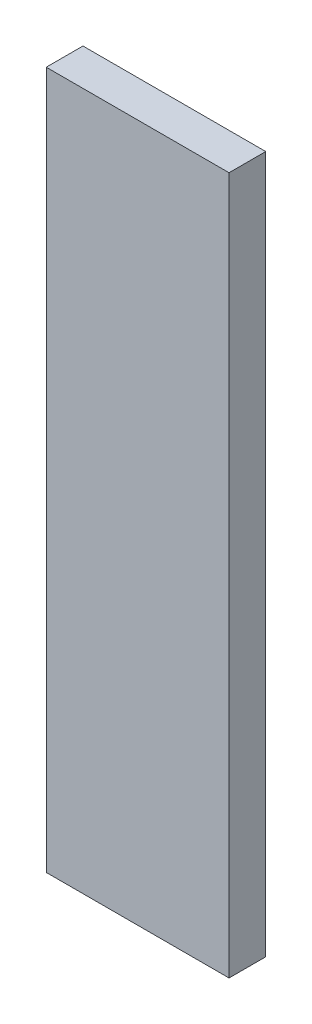
ISO-10303-21;
HEADER;
FILE_DESCRIPTION(('STEP AP214'),'2;1');
FILE_NAME('part.step','',(''),(''),'','','');
FILE_SCHEMA(('AUTOMOTIVE_DESIGN { 1 0 10303 214 1 1 1 1 }'));
ENDSEC;
DATA;
#1=APPLICATION_CONTEXT('core data for automotive mechanical design processes');
#2=APPLICATION_PROTOCOL_DEFINITION('international standard','automotive_design',2000,#1);
#3=PRODUCT_CONTEXT('',#1,'mechanical');
#4=PRODUCT('Part','Part','',(#3));
#5=PRODUCT_RELATED_PRODUCT_CATEGORY('part','',(#4));
#6=PRODUCT_DEFINITION_FORMATION('','',#4);
#7=PRODUCT_DEFINITION_CONTEXT('part definition',#1,'design');
#8=PRODUCT_DEFINITION('design','',#6,#7);
#9=PRODUCT_DEFINITION_SHAPE('','',#8);
#10=(LENGTH_UNIT() NAMED_UNIT(*) SI_UNIT(.MILLI.,.METRE.));
#11=(NAMED_UNIT(*) PLANE_ANGLE_UNIT() SI_UNIT($,.RADIAN.));
#12=(NAMED_UNIT(*) SI_UNIT($,.STERADIAN.) SOLID_ANGLE_UNIT());
#13=UNCERTAINTY_MEASURE_WITH_UNIT(LENGTH_MEASURE(1.E-05),#10,'distance_accuracy_value','');
#14=(GEOMETRIC_REPRESENTATION_CONTEXT(3) GLOBAL_UNCERTAINTY_ASSIGNED_CONTEXT((#13)) GLOBAL_UNIT_ASSIGNED_CONTEXT((#10,
#11,#12)) REPRESENTATION_CONTEXT('',''));
#15=CARTESIAN_POINT('',(0.,0.,0.));
#16=DIRECTION('',(0.,0.,1.));
#17=DIRECTION('',(1.,0.,0.));
#18=AXIS2_PLACEMENT_3D('',#15,#16,#17);
#19=CARTESIAN_POINT('',(24.9,95.,5.));
#20=DIRECTION('',(-1.,0.,0.));
#21=DIRECTION('',(0.,-1.,0.));
#22=AXIS2_PLACEMENT_3D('',#19,#20,#21);
#23=PLANE('',#22);
#24=DIRECTION('',(0.,1.,0.));
#25=VECTOR('',#24,1.);
#26=CARTESIAN_POINT('',(24.9,95.,-5.));
#27=LINE('',#26,#25);
#28=CARTESIAN_POINT('',(24.9,-95.,-5.));
#29=VERTEX_POINT('',#28);
#30=CARTESIAN_POINT('',(24.9,95.,-5.));
#31=VERTEX_POINT('',#30);
#32=EDGE_CURVE('E149',#29,#31,#27,.T.);
#33=ORIENTED_EDGE('',*,*,#32,.T.);
#34=DIRECTION('',(0.,0.,-1.));
#35=VECTOR('',#34,1.);
#36=CARTESIAN_POINT('',(24.9,95.,5.));
#37=LINE('',#36,#35);
#38=CARTESIAN_POINT('',(24.9,95.,5.));
#39=VERTEX_POINT('',#38);
#40=EDGE_CURVE('E11',#39,#31,#37,.T.);
#41=ORIENTED_EDGE('',*,*,#40,.F.);
#42=DIRECTION('',(0.,1.,0.));
#43=VECTOR('',#42,1.);
#44=CARTESIAN_POINT('',(24.9,95.,5.));
#45=LINE('',#44,#43);
#46=CARTESIAN_POINT('',(24.9,-95.,5.));
#47=VERTEX_POINT('',#46);
#48=EDGE_CURVE('E153',#47,#39,#45,.T.);
#49=ORIENTED_EDGE('',*,*,#48,.F.);
#50=DIRECTION('',(0.,0.,-1.));
#51=VECTOR('',#50,1.);
#52=CARTESIAN_POINT('',(24.9,-95.,5.));
#53=LINE('',#52,#51);
#54=EDGE_CURVE('E157',#47,#29,#53,.T.);
#55=ORIENTED_EDGE('',*,*,#54,.T.);
#56=EDGE_LOOP('',(#33,#41,#49,#55));
#57=FACE_BOUND('',#56,.T.);
#58=ADVANCED_FACE('F41',(#57),#23,.F.);
#59=CARTESIAN_POINT('',(-24.9,95.,5.));
#60=DIRECTION('',(0.,-1.,0.));
#61=DIRECTION('',(0.,0.,-1.));
#62=AXIS2_PLACEMENT_3D('',#59,#60,#61);
#63=PLANE('',#62);
#64=DIRECTION('',(-1.,0.,0.));
#65=VECTOR('',#64,1.);
#66=CARTESIAN_POINT('',(-24.9,95.,-5.));
#67=LINE('',#66,#65);
#68=CARTESIAN_POINT('',(-24.9,95.,-5.));
#69=VERTEX_POINT('',#68);
#70=EDGE_CURVE('E165',#31,#69,#67,.T.);
#71=ORIENTED_EDGE('',*,*,#70,.T.);
#72=DIRECTION('',(0.,0.,-1.));
#73=VECTOR('',#72,1.);
#74=CARTESIAN_POINT('',(-24.9,95.,5.));
#75=LINE('',#74,#73);
#76=CARTESIAN_POINT('',(-24.9,95.,5.));
#77=VERTEX_POINT('',#76);
#78=EDGE_CURVE('E48',#77,#69,#75,.T.);
#79=ORIENTED_EDGE('',*,*,#78,.F.);
#80=DIRECTION('',(-1.,0.,0.));
#81=VECTOR('',#80,1.);
#82=CARTESIAN_POINT('',(-24.9,95.,5.));
#83=LINE('',#82,#81);
#84=EDGE_CURVE('E95',#39,#77,#83,.T.);
#85=ORIENTED_EDGE('',*,*,#84,.F.);
#86=ORIENTED_EDGE('',*,*,#40,.T.);
#87=EDGE_LOOP('',(#71,#79,#85,#86));
#88=FACE_BOUND('',#87,.T.);
#89=ADVANCED_FACE('F191',(#88),#63,.F.);
#90=CARTESIAN_POINT('',(-24.9,95.,5.));
#91=DIRECTION('',(1.,0.,0.));
#92=DIRECTION('',(0.,1.,0.));
#93=AXIS2_PLACEMENT_3D('',#90,#91,#92);
#94=PLANE('',#93);
#95=DIRECTION('',(0.,-1.,0.));
#96=VECTOR('',#95,1.);
#97=CARTESIAN_POINT('',(-24.9,95.,-5.));
#98=LINE('',#97,#96);
#99=CARTESIAN_POINT('',(-24.9,-95.,-5.));
#100=VERTEX_POINT('',#99);
#101=EDGE_CURVE('E163',#69,#100,#98,.T.);
#102=ORIENTED_EDGE('',*,*,#101,.T.);
#103=DIRECTION('',(0.,0.,-1.));
#104=VECTOR('',#103,1.);
#105=CARTESIAN_POINT('',(-24.9,-95.,5.));
#106=LINE('',#105,#104);
#107=CARTESIAN_POINT('',(-24.9,-95.,5.));
#108=VERTEX_POINT('',#107);
#109=EDGE_CURVE('E169',#108,#100,#106,.T.);
#110=ORIENTED_EDGE('',*,*,#109,.F.);
#111=DIRECTION('',(0.,-1.,0.));
#112=VECTOR('',#111,1.);
#113=CARTESIAN_POINT('',(-24.9,95.,5.));
#114=LINE('',#113,#112);
#115=EDGE_CURVE('E156',#77,#108,#114,.T.);
#116=ORIENTED_EDGE('',*,*,#115,.F.);
#117=ORIENTED_EDGE('',*,*,#78,.T.);
#118=EDGE_LOOP('',(#102,#110,#116,#117));
#119=FACE_BOUND('',#118,.T.);
#120=ADVANCED_FACE('F174',(#119),#94,.F.);
#121=CARTESIAN_POINT('',(-24.9,-95.,5.));
#122=DIRECTION('',(0.,1.,0.));
#123=DIRECTION('',(0.,0.,1.));
#124=AXIS2_PLACEMENT_3D('',#121,#122,#123);
#125=PLANE('',#124);
#126=DIRECTION('',(-1.,0.,0.));
#127=VECTOR('',#126,1.);
#128=CARTESIAN_POINT('',(-15.2,-95.,3.15));
#129=LINE('',#128,#127);
#130=CARTESIAN_POINT('',(15.2,-95.,3.15));
#131=VERTEX_POINT('',#130);
#132=CARTESIAN_POINT('',(-15.2,-95.,3.15));
#133=VERTEX_POINT('',#132);
#134=EDGE_CURVE('E141',#131,#133,#129,.T.);
#135=ORIENTED_EDGE('',*,*,#134,.F.);
#136=DIRECTION('',(0.,0.,1.));
#137=VECTOR('',#136,1.);
#138=CARTESIAN_POINT('',(15.2,-95.,3.15));
#139=LINE('',#138,#137);
#140=CARTESIAN_POINT('',(15.2,-95.,-3.15));
#141=VERTEX_POINT('',#140);
#142=EDGE_CURVE('E54',#141,#131,#139,.T.);
#143=ORIENTED_EDGE('',*,*,#142,.F.);
#144=DIRECTION('',(1.,0.,0.));
#145=VECTOR('',#144,1.);
#146=CARTESIAN_POINT('',(-15.2,-95.,-3.15));
#147=LINE('',#146,#145);
#148=CARTESIAN_POINT('',(-15.2,-95.,-3.15));
#149=VERTEX_POINT('',#148);
#150=EDGE_CURVE('E133',#149,#141,#147,.T.);
#151=ORIENTED_EDGE('',*,*,#150,.F.);
#152=DIRECTION('',(0.,0.,-1.));
#153=VECTOR('',#152,1.);
#154=CARTESIAN_POINT('',(-15.2,-95.,3.15));
#155=LINE('',#154,#153);
#156=EDGE_CURVE('E140',#133,#149,#155,.T.);
#157=ORIENTED_EDGE('',*,*,#156,.F.);
#158=EDGE_LOOP('',(#135,#143,#151,#157));
#159=FACE_BOUND('',#158,.T.);
#160=DIRECTION('',(1.,0.,0.));
#161=VECTOR('',#160,1.);
#162=CARTESIAN_POINT('',(-24.9,-95.,-5.));
#163=LINE('',#162,#161);
#164=EDGE_CURVE('E84',#100,#29,#163,.T.);
#165=ORIENTED_EDGE('',*,*,#164,.T.);
#166=ORIENTED_EDGE('',*,*,#54,.F.);
#167=DIRECTION('',(1.,0.,0.));
#168=VECTOR('',#167,1.);
#169=CARTESIAN_POINT('',(-24.9,-95.,5.));
#170=LINE('',#169,#168);
#171=EDGE_CURVE('E63',#108,#47,#170,.T.);
#172=ORIENTED_EDGE('',*,*,#171,.F.);
#173=ORIENTED_EDGE('',*,*,#109,.T.);
#174=EDGE_LOOP('',(#165,#166,#172,#173));
#175=FACE_BOUND('',#174,.T.);
#176=ADVANCED_FACE('F182',(#159,#175),#125,.F.);
#177=CARTESIAN_POINT('',(0.,0.,5.));
#178=DIRECTION('',(0.,0.,1.));
#179=DIRECTION('',(1.,0.,0.));
#180=AXIS2_PLACEMENT_3D('',#177,#178,#179);
#181=PLANE('',#180);
#182=ORIENTED_EDGE('',*,*,#48,.T.);
#183=ORIENTED_EDGE('',*,*,#84,.T.);
#184=ORIENTED_EDGE('',*,*,#115,.T.);
#185=ORIENTED_EDGE('',*,*,#171,.T.);
#186=EDGE_LOOP('',(#182,#183,#184,#185));
#187=FACE_BOUND('',#186,.T.);
#188=ADVANCED_FACE('F181',(#187),#181,.T.);
#189=CARTESIAN_POINT('',(0.,0.,-5.));
#190=DIRECTION('',(0.,0.,1.));
#191=DIRECTION('',(1.,0.,0.));
#192=AXIS2_PLACEMENT_3D('',#189,#190,#191);
#193=PLANE('',#192);
#194=ORIENTED_EDGE('',*,*,#32,.F.);
#195=ORIENTED_EDGE('',*,*,#164,.F.);
#196=ORIENTED_EDGE('',*,*,#101,.F.);
#197=ORIENTED_EDGE('',*,*,#70,.F.);
#198=EDGE_LOOP('',(#194,#195,#196,#197));
#199=FACE_BOUND('',#198,.T.);
#200=ADVANCED_FACE('F180',(#199),#193,.F.);
#201=CARTESIAN_POINT('',(15.2,-45.,3.15));
#202=DIRECTION('',(1.,0.,0.));
#203=DIRECTION('',(0.,0.,-1.));
#204=AXIS2_PLACEMENT_3D('',#201,#202,#203);
#205=PLANE('',#204);
#206=ORIENTED_EDGE('',*,*,#142,.T.);
#207=DIRECTION('',(0.,-1.,0.));
#208=VECTOR('',#207,1.);
#209=CARTESIAN_POINT('',(15.2,-45.,3.15));
#210=LINE('',#209,#208);
#211=CARTESIAN_POINT('',(15.2,-45.,3.15));
#212=VERTEX_POINT('',#211);
#213=EDGE_CURVE('E115',#212,#131,#210,.T.);
#214=ORIENTED_EDGE('',*,*,#213,.F.);
#215=DIRECTION('',(0.,0.,1.));
#216=VECTOR('',#215,1.);
#217=CARTESIAN_POINT('',(15.2,-45.,3.15));
#218=LINE('',#217,#216);
#219=CARTESIAN_POINT('',(15.2,-45.,-3.15));
#220=VERTEX_POINT('',#219);
#221=EDGE_CURVE('E116',#220,#212,#218,.T.);
#222=ORIENTED_EDGE('',*,*,#221,.F.);
#223=DIRECTION('',(0.,-1.,0.));
#224=VECTOR('',#223,1.);
#225=CARTESIAN_POINT('',(15.2,-45.,-3.15));
#226=LINE('',#225,#224);
#227=EDGE_CURVE('E150',#220,#141,#226,.T.);
#228=ORIENTED_EDGE('',*,*,#227,.T.);
#229=EDGE_LOOP('',(#206,#214,#222,#228));
#230=FACE_BOUND('',#229,.T.);
#231=ADVANCED_FACE('F111',(#230),#205,.F.);
#232=CARTESIAN_POINT('',(-15.2,-45.,-3.15));
#233=DIRECTION('',(0.,0.,-1.));
#234=DIRECTION('',(-1.,0.,0.));
#235=AXIS2_PLACEMENT_3D('',#232,#233,#234);
#236=PLANE('',#235);
#237=ORIENTED_EDGE('',*,*,#150,.T.);
#238=ORIENTED_EDGE('',*,*,#227,.F.);
#239=DIRECTION('',(1.,0.,0.));
#240=VECTOR('',#239,1.);
#241=CARTESIAN_POINT('',(-15.2,-45.,-3.15));
#242=LINE('',#241,#240);
#243=CARTESIAN_POINT('',(-15.2,-45.,-3.15));
#244=VERTEX_POINT('',#243);
#245=EDGE_CURVE('E125',#244,#220,#242,.T.);
#246=ORIENTED_EDGE('',*,*,#245,.F.);
#247=DIRECTION('',(0.,-1.,0.));
#248=VECTOR('',#247,1.);
#249=CARTESIAN_POINT('',(-15.2,-45.,-3.15));
#250=LINE('',#249,#248);
#251=EDGE_CURVE('E147',#244,#149,#250,.T.);
#252=ORIENTED_EDGE('',*,*,#251,.T.);
#253=EDGE_LOOP('',(#237,#238,#246,#252));
#254=FACE_BOUND('',#253,.T.);
#255=ADVANCED_FACE('F226',(#254),#236,.F.);
#256=CARTESIAN_POINT('',(-15.2,-45.,3.15));
#257=DIRECTION('',(-1.,0.,0.));
#258=DIRECTION('',(0.,0.,1.));
#259=AXIS2_PLACEMENT_3D('',#256,#257,#258);
#260=PLANE('',#259);
#261=ORIENTED_EDGE('',*,*,#156,.T.);
#262=ORIENTED_EDGE('',*,*,#251,.F.);
#263=DIRECTION('',(0.,0.,-1.));
#264=VECTOR('',#263,1.);
#265=CARTESIAN_POINT('',(-15.2,-45.,3.15));
#266=LINE('',#265,#264);
#267=CARTESIAN_POINT('',(-15.2,-45.,3.15));
#268=VERTEX_POINT('',#267);
#269=EDGE_CURVE('E128',#268,#244,#266,.T.);
#270=ORIENTED_EDGE('',*,*,#269,.F.);
#271=DIRECTION('',(0.,-1.,0.));
#272=VECTOR('',#271,1.);
#273=CARTESIAN_POINT('',(-15.2,-45.,3.15));
#274=LINE('',#273,#272);
#275=EDGE_CURVE('E123',#268,#133,#274,.T.);
#276=ORIENTED_EDGE('',*,*,#275,.T.);
#277=EDGE_LOOP('',(#261,#262,#270,#276));
#278=FACE_BOUND('',#277,.T.);
#279=ADVANCED_FACE('F234',(#278),#260,.F.);
#280=CARTESIAN_POINT('',(-15.2,-45.,3.15));
#281=DIRECTION('',(0.,0.,1.));
#282=DIRECTION('',(1.,0.,0.));
#283=AXIS2_PLACEMENT_3D('',#280,#281,#282);
#284=PLANE('',#283);
#285=ORIENTED_EDGE('',*,*,#134,.T.);
#286=ORIENTED_EDGE('',*,*,#275,.F.);
#287=DIRECTION('',(-1.,0.,0.));
#288=VECTOR('',#287,1.);
#289=CARTESIAN_POINT('',(-15.2,-45.,3.15));
#290=LINE('',#289,#288);
#291=EDGE_CURVE('E124',#212,#268,#290,.T.);
#292=ORIENTED_EDGE('',*,*,#291,.F.);
#293=ORIENTED_EDGE('',*,*,#213,.T.);
#294=EDGE_LOOP('',(#285,#286,#292,#293));
#295=FACE_BOUND('',#294,.T.);
#296=ADVANCED_FACE('F127',(#295),#284,.F.);
#297=CARTESIAN_POINT('',(0.,-45.,0.));
#298=DIRECTION('',(0.,-1.,0.));
#299=DIRECTION('',(0.,0.,-1.));
#300=AXIS2_PLACEMENT_3D('',#297,#298,#299);
#301=PLANE('',#300);
#302=ORIENTED_EDGE('',*,*,#221,.T.);
#303=ORIENTED_EDGE('',*,*,#291,.T.);
#304=ORIENTED_EDGE('',*,*,#269,.T.);
#305=ORIENTED_EDGE('',*,*,#245,.T.);
#306=EDGE_LOOP('',(#302,#303,#304,#305));
#307=FACE_BOUND('',#306,.T.);
#308=ADVANCED_FACE('F132',(#307),#301,.T.);
#309=CLOSED_SHELL('',(#58,#89,#120,#176,#188,#200,#231,#255,#279,#296,#308));
#310=MANIFOLD_SOLID_BREP('B2',#309);
#311=ADVANCED_BREP_SHAPE_REPRESENTATION('',(#18,#310),#14);
#312=SHAPE_DEFINITION_REPRESENTATION(#9,#311);
ENDSEC;
END-ISO-10303-21;
